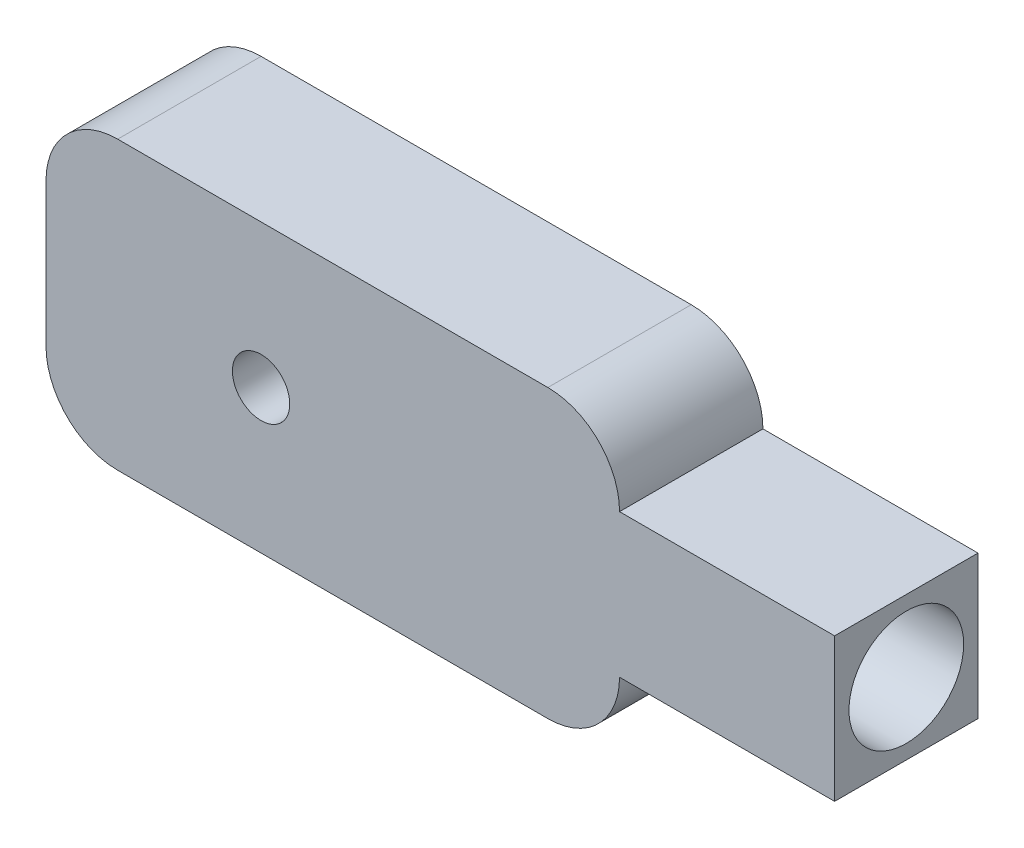
ISO-10303-21;
HEADER;
FILE_DESCRIPTION(('STEP AP214'),'2;1');
FILE_NAME('part.step','',(''),(''),'','','');
FILE_SCHEMA(('AUTOMOTIVE_DESIGN { 1 0 10303 214 1 1 1 1 }'));
ENDSEC;
DATA;
#1=APPLICATION_CONTEXT('core data for automotive mechanical design processes');
#2=APPLICATION_PROTOCOL_DEFINITION('international standard','automotive_design',2000,#1);
#3=PRODUCT_CONTEXT('',#1,'mechanical');
#4=PRODUCT('Part','Part','',(#3));
#5=PRODUCT_RELATED_PRODUCT_CATEGORY('part','',(#4));
#6=PRODUCT_DEFINITION_FORMATION('','',#4);
#7=PRODUCT_DEFINITION_CONTEXT('part definition',#1,'design');
#8=PRODUCT_DEFINITION('design','',#6,#7);
#9=PRODUCT_DEFINITION_SHAPE('','',#8);
#10=(LENGTH_UNIT() NAMED_UNIT(*) SI_UNIT(.MILLI.,.METRE.));
#11=(NAMED_UNIT(*) PLANE_ANGLE_UNIT() SI_UNIT($,.RADIAN.));
#12=(NAMED_UNIT(*) SI_UNIT($,.STERADIAN.) SOLID_ANGLE_UNIT());
#13=UNCERTAINTY_MEASURE_WITH_UNIT(LENGTH_MEASURE(1.E-05),#10,'distance_accuracy_value','');
#14=(GEOMETRIC_REPRESENTATION_CONTEXT(3) GLOBAL_UNCERTAINTY_ASSIGNED_CONTEXT((#13)) GLOBAL_UNIT_ASSIGNED_CONTEXT((#10,
#11,#12)) REPRESENTATION_CONTEXT('',''));
#15=CARTESIAN_POINT('',(0.,0.,0.));
#16=DIRECTION('',(0.,0.,1.));
#17=DIRECTION('',(1.,0.,0.));
#18=AXIS2_PLACEMENT_3D('',#15,#16,#17);
#19=CARTESIAN_POINT('',(-25.4,-12.7,12.7));
#20=DIRECTION('',(1.,0.,0.));
#21=DIRECTION('',(0.,0.,-1.));
#22=AXIS2_PLACEMENT_3D('',#19,#20,#21);
#23=PLANE('',#22);
#24=DIRECTION('',(0.,-1.,0.));
#25=VECTOR('',#24,1.);
#26=CARTESIAN_POINT('',(-25.4,-12.7,0.));
#27=LINE('',#26,#25);
#28=CARTESIAN_POINT('',(-25.4,6.34999999999999,0.));
#29=VERTEX_POINT('',#28);
#30=CARTESIAN_POINT('',(-25.4,-6.35,0.));
#31=VERTEX_POINT('',#30);
#32=EDGE_CURVE('E145',#29,#31,#27,.T.);
#33=ORIENTED_EDGE('',*,*,#32,.T.);
#34=DIRECTION('',(0.,0.,-1.));
#35=VECTOR('',#34,1.);
#36=CARTESIAN_POINT('',(-25.4,-6.35,12.7));
#37=LINE('',#36,#35);
#38=CARTESIAN_POINT('',(-25.4,-6.35,12.7));
#39=VERTEX_POINT('',#38);
#40=EDGE_CURVE('E177',#31,#39,#37,.F.);
#41=ORIENTED_EDGE('',*,*,#40,.T.);
#42=DIRECTION('',(0.,-1.,0.));
#43=VECTOR('',#42,1.);
#44=CARTESIAN_POINT('',(-25.4,-12.7,12.7));
#45=LINE('',#44,#43);
#46=CARTESIAN_POINT('',(-25.4,6.34999999999999,12.7));
#47=VERTEX_POINT('',#46);
#48=EDGE_CURVE('E147',#47,#39,#45,.T.);
#49=ORIENTED_EDGE('',*,*,#48,.F.);
#50=DIRECTION('',(0.,0.,-1.));
#51=VECTOR('',#50,1.);
#52=CARTESIAN_POINT('',(-25.4,6.34999999999999,12.7));
#53=LINE('',#52,#51);
#54=EDGE_CURVE('E174',#47,#29,#53,.T.);
#55=ORIENTED_EDGE('',*,*,#54,.T.);
#56=EDGE_LOOP('',(#33,#41,#49,#55));
#57=FACE_BOUND('',#56,.T.);
#58=ADVANCED_FACE('F33',(#57),#23,.F.);
#59=CARTESIAN_POINT('',(25.4,-12.7,12.7));
#60=DIRECTION('',(0.,1.,0.));
#61=DIRECTION('',(-1.,0.,0.));
#62=AXIS2_PLACEMENT_3D('',#59,#60,#61);
#63=PLANE('',#62);
#64=DIRECTION('',(1.,0.,0.));
#65=VECTOR('',#64,1.);
#66=CARTESIAN_POINT('',(25.4,-12.7,12.7));
#67=LINE('',#66,#65);
#68=CARTESIAN_POINT('',(-19.05,-12.7,12.7));
#69=VERTEX_POINT('',#68);
#70=CARTESIAN_POINT('',(19.05,-12.7,12.7));
#71=VERTEX_POINT('',#70);
#72=EDGE_CURVE('E150',#69,#71,#67,.T.);
#73=ORIENTED_EDGE('',*,*,#72,.F.);
#74=DIRECTION('',(0.,0.,-1.));
#75=VECTOR('',#74,1.);
#76=CARTESIAN_POINT('',(-19.05,-12.7,12.7));
#77=LINE('',#76,#75);
#78=CARTESIAN_POINT('',(-19.05,-12.7,0.));
#79=VERTEX_POINT('',#78);
#80=EDGE_CURVE('E164',#69,#79,#77,.T.);
#81=ORIENTED_EDGE('',*,*,#80,.T.);
#82=DIRECTION('',(1.,0.,0.));
#83=VECTOR('',#82,1.);
#84=CARTESIAN_POINT('',(25.4,-12.7,0.));
#85=LINE('',#84,#83);
#86=CARTESIAN_POINT('',(19.05,-12.7,0.));
#87=VERTEX_POINT('',#86);
#88=EDGE_CURVE('E159',#79,#87,#85,.T.);
#89=ORIENTED_EDGE('',*,*,#88,.T.);
#90=DIRECTION('',(0.,0.,-1.));
#91=VECTOR('',#90,1.);
#92=CARTESIAN_POINT('',(19.05,-12.7,12.7));
#93=LINE('',#92,#91);
#94=EDGE_CURVE('E156',#87,#71,#93,.F.);
#95=ORIENTED_EDGE('',*,*,#94,.T.);
#96=EDGE_LOOP('',(#73,#81,#89,#95));
#97=FACE_BOUND('',#96,.T.);
#98=ADVANCED_FACE('F209',(#97),#63,.F.);
#99=CARTESIAN_POINT('',(25.4,12.7,12.7));
#100=DIRECTION('',(0.,-1.,0.));
#101=DIRECTION('',(1.,0.,0.));
#102=AXIS2_PLACEMENT_3D('',#99,#100,#101);
#103=PLANE('',#102);
#104=DIRECTION('',(-1.,0.,0.));
#105=VECTOR('',#104,1.);
#106=CARTESIAN_POINT('',(25.4,12.7,0.));
#107=LINE('',#106,#105);
#108=CARTESIAN_POINT('',(19.05,12.7,0.));
#109=VERTEX_POINT('',#108);
#110=CARTESIAN_POINT('',(-19.05,12.7,0.));
#111=VERTEX_POINT('',#110);
#112=EDGE_CURVE('E151',#109,#111,#107,.T.);
#113=ORIENTED_EDGE('',*,*,#112,.T.);
#114=DIRECTION('',(0.,0.,-1.));
#115=VECTOR('',#114,1.);
#116=CARTESIAN_POINT('',(-19.05,12.7,12.7));
#117=LINE('',#116,#115);
#118=CARTESIAN_POINT('',(-19.05,12.7,12.7));
#119=VERTEX_POINT('',#118);
#120=EDGE_CURVE('E11',#111,#119,#117,.F.);
#121=ORIENTED_EDGE('',*,*,#120,.T.);
#122=DIRECTION('',(-1.,0.,0.));
#123=VECTOR('',#122,1.);
#124=CARTESIAN_POINT('',(25.4,12.7,12.7));
#125=LINE('',#124,#123);
#126=CARTESIAN_POINT('',(19.05,12.7,12.7));
#127=VERTEX_POINT('',#126);
#128=EDGE_CURVE('E154',#127,#119,#125,.T.);
#129=ORIENTED_EDGE('',*,*,#128,.F.);
#130=DIRECTION('',(0.,0.,-1.));
#131=VECTOR('',#130,1.);
#132=CARTESIAN_POINT('',(19.05,12.7,12.7));
#133=LINE('',#132,#131);
#134=EDGE_CURVE('E41',#127,#109,#133,.T.);
#135=ORIENTED_EDGE('',*,*,#134,.T.);
#136=EDGE_LOOP('',(#113,#121,#129,#135));
#137=FACE_BOUND('',#136,.T.);
#138=ADVANCED_FACE('F192',(#137),#103,.F.);
#139=CARTESIAN_POINT('',(0.,0.,12.7));
#140=DIRECTION('',(0.,0.,1.));
#141=DIRECTION('',(1.,0.,0.));
#142=AXIS2_PLACEMENT_3D('',#139,#140,#141);
#143=PLANE('',#142);
#144=CARTESIAN_POINT('',(-6.35000000000001,0.,12.7));
#145=DIRECTION('',(0.,0.,1.));
#146=DIRECTION('',(1.,0.,0.));
#147=AXIS2_PLACEMENT_3D('',#144,#145,#146);
#148=CIRCLE('',#147,2.54);
#149=CARTESIAN_POINT('',(-3.81000000000001,0.,12.7));
#150=VERTEX_POINT('',#149);
#151=EDGE_CURVE('E135',#150,#150,#148,.T.);
#152=ORIENTED_EDGE('',*,*,#151,.F.);
#153=EDGE_LOOP('',(#152));
#154=FACE_BOUND('',#153,.T.);
#155=ORIENTED_EDGE('',*,*,#48,.T.);
#156=CARTESIAN_POINT('',(-19.05,-6.35,12.7));
#157=DIRECTION('',(0.,0.,1.));
#158=DIRECTION('',(1.,0.,0.));
#159=AXIS2_PLACEMENT_3D('',#156,#157,#158);
#160=CIRCLE('',#159,6.35);
#161=EDGE_CURVE('E184',#39,#69,#160,.T.);
#162=ORIENTED_EDGE('',*,*,#161,.T.);
#163=ORIENTED_EDGE('',*,*,#72,.T.);
#164=CARTESIAN_POINT('',(19.05,-6.35,12.7));
#165=DIRECTION('',(0.,0.,1.));
#166=DIRECTION('',(1.,0.,0.));
#167=AXIS2_PLACEMENT_3D('',#164,#165,#166);
#168=CIRCLE('',#167,6.35);
#169=CARTESIAN_POINT('',(25.4,-6.35,12.7));
#170=VERTEX_POINT('',#169);
#171=EDGE_CURVE('E182',#71,#170,#168,.T.);
#172=ORIENTED_EDGE('',*,*,#171,.T.);
#173=DIRECTION('',(-1.,0.,0.));
#174=VECTOR('',#173,1.);
#175=CARTESIAN_POINT('',(44.45,-6.35,12.7));
#176=LINE('',#175,#174);
#177=CARTESIAN_POINT('',(44.45,-6.35,12.7));
#178=VERTEX_POINT('',#177);
#179=EDGE_CURVE('E140',#178,#170,#176,.T.);
#180=ORIENTED_EDGE('',*,*,#179,.F.);
#181=DIRECTION('',(0.,-1.,0.));
#182=VECTOR('',#181,1.);
#183=CARTESIAN_POINT('',(44.45,6.35,12.7));
#184=LINE('',#183,#182);
#185=CARTESIAN_POINT('',(44.45,6.35,12.7));
#186=VERTEX_POINT('',#185);
#187=EDGE_CURVE('E118',#186,#178,#184,.T.);
#188=ORIENTED_EDGE('',*,*,#187,.F.);
#189=DIRECTION('',(-1.,0.,0.));
#190=VECTOR('',#189,1.);
#191=CARTESIAN_POINT('',(44.45,6.35,12.7));
#192=LINE('',#191,#190);
#193=CARTESIAN_POINT('',(25.4,6.35,12.7));
#194=VERTEX_POINT('',#193);
#195=EDGE_CURVE('E115',#186,#194,#192,.T.);
#196=ORIENTED_EDGE('',*,*,#195,.T.);
#197=CARTESIAN_POINT('',(19.05,6.35,12.7));
#198=DIRECTION('',(0.,0.,1.));
#199=DIRECTION('',(1.,0.,0.));
#200=AXIS2_PLACEMENT_3D('',#197,#198,#199);
#201=CIRCLE('',#200,6.35);
#202=EDGE_CURVE('E53',#194,#127,#201,.T.);
#203=ORIENTED_EDGE('',*,*,#202,.T.);
#204=ORIENTED_EDGE('',*,*,#128,.T.);
#205=CARTESIAN_POINT('',(-19.05,6.34999999999999,12.7));
#206=DIRECTION('',(0.,0.,1.));
#207=DIRECTION('',(1.,0.,0.));
#208=AXIS2_PLACEMENT_3D('',#205,#206,#207);
#209=CIRCLE('',#208,6.35);
#210=EDGE_CURVE('E180',#119,#47,#209,.T.);
#211=ORIENTED_EDGE('',*,*,#210,.T.);
#212=EDGE_LOOP('',(#155,#162,#163,#172,#180,#188,#196,#203,#204,#211));
#213=FACE_BOUND('',#212,.T.);
#214=ADVANCED_FACE('F203',(#154,#213),#143,.T.);
#215=CARTESIAN_POINT('',(0.,0.,0.));
#216=DIRECTION('',(0.,0.,1.));
#217=DIRECTION('',(1.,0.,0.));
#218=AXIS2_PLACEMENT_3D('',#215,#216,#217);
#219=PLANE('',#218);
#220=CARTESIAN_POINT('',(-6.35000000000001,0.,0.));
#221=DIRECTION('',(0.,0.,1.));
#222=DIRECTION('',(1.,0.,0.));
#223=AXIS2_PLACEMENT_3D('',#220,#221,#222);
#224=CIRCLE('',#223,2.54);
#225=CARTESIAN_POINT('',(-3.81000000000001,0.,0.));
#226=VERTEX_POINT('',#225);
#227=EDGE_CURVE('E138',#226,#226,#224,.T.);
#228=ORIENTED_EDGE('',*,*,#227,.T.);
#229=EDGE_LOOP('',(#228));
#230=FACE_BOUND('',#229,.T.);
#231=ORIENTED_EDGE('',*,*,#88,.F.);
#232=CARTESIAN_POINT('',(-19.05,-6.35,0.));
#233=DIRECTION('',(0.,0.,1.));
#234=DIRECTION('',(1.,0.,0.));
#235=AXIS2_PLACEMENT_3D('',#232,#233,#234);
#236=CIRCLE('',#235,6.35);
#237=EDGE_CURVE('E172',#79,#31,#236,.F.);
#238=ORIENTED_EDGE('',*,*,#237,.T.);
#239=ORIENTED_EDGE('',*,*,#32,.F.);
#240=CARTESIAN_POINT('',(-19.05,6.34999999999999,0.));
#241=DIRECTION('',(0.,0.,1.));
#242=DIRECTION('',(1.,0.,0.));
#243=AXIS2_PLACEMENT_3D('',#240,#241,#242);
#244=CIRCLE('',#243,6.35);
#245=EDGE_CURVE('E168',#29,#111,#244,.F.);
#246=ORIENTED_EDGE('',*,*,#245,.T.);
#247=ORIENTED_EDGE('',*,*,#112,.F.);
#248=CARTESIAN_POINT('',(19.05,6.35,0.));
#249=DIRECTION('',(0.,0.,1.));
#250=DIRECTION('',(1.,0.,0.));
#251=AXIS2_PLACEMENT_3D('',#248,#249,#250);
#252=CIRCLE('',#251,6.35);
#253=CARTESIAN_POINT('',(25.4,6.35,0.));
#254=VERTEX_POINT('',#253);
#255=EDGE_CURVE('E133',#109,#254,#252,.F.);
#256=ORIENTED_EDGE('',*,*,#255,.T.);
#257=DIRECTION('',(-1.,0.,0.));
#258=VECTOR('',#257,1.);
#259=CARTESIAN_POINT('',(44.45,6.35,0.));
#260=LINE('',#259,#258);
#261=CARTESIAN_POINT('',(44.45,6.35,0.));
#262=VERTEX_POINT('',#261);
#263=EDGE_CURVE('E114',#262,#254,#260,.T.);
#264=ORIENTED_EDGE('',*,*,#263,.F.);
#265=DIRECTION('',(0.,1.,0.));
#266=VECTOR('',#265,1.);
#267=CARTESIAN_POINT('',(44.45,6.35,0.));
#268=LINE('',#267,#266);
#269=CARTESIAN_POINT('',(44.45,-6.35,0.));
#270=VERTEX_POINT('',#269);
#271=EDGE_CURVE('E119',#270,#262,#268,.T.);
#272=ORIENTED_EDGE('',*,*,#271,.F.);
#273=DIRECTION('',(-1.,0.,0.));
#274=VECTOR('',#273,1.);
#275=CARTESIAN_POINT('',(44.45,-6.35,0.));
#276=LINE('',#275,#274);
#277=CARTESIAN_POINT('',(25.4,-6.35,0.));
#278=VERTEX_POINT('',#277);
#279=EDGE_CURVE('E211',#270,#278,#276,.T.);
#280=ORIENTED_EDGE('',*,*,#279,.T.);
#281=CARTESIAN_POINT('',(19.05,-6.35,0.));
#282=DIRECTION('',(0.,0.,1.));
#283=DIRECTION('',(1.,0.,0.));
#284=AXIS2_PLACEMENT_3D('',#281,#282,#283);
#285=CIRCLE('',#284,6.35);
#286=EDGE_CURVE('E170',#278,#87,#285,.F.);
#287=ORIENTED_EDGE('',*,*,#286,.T.);
#288=EDGE_LOOP('',(#231,#238,#239,#246,#247,#256,#264,#272,#280,#287));
#289=FACE_BOUND('',#288,.T.);
#290=ADVANCED_FACE('F131',(#230,#289),#219,.F.);
#291=CARTESIAN_POINT('',(-19.05,-6.35,12.7));
#292=DIRECTION('',(0.,0.,-1.));
#293=DIRECTION('',(-1.,0.,0.));
#294=AXIS2_PLACEMENT_3D('',#291,#292,#293);
#295=CYLINDRICAL_SURFACE('',#294,6.35);
#296=ORIENTED_EDGE('',*,*,#161,.F.);
#297=ORIENTED_EDGE('',*,*,#40,.F.);
#298=ORIENTED_EDGE('',*,*,#237,.F.);
#299=ORIENTED_EDGE('',*,*,#80,.F.);
#300=EDGE_LOOP('',(#296,#297,#298,#299));
#301=FACE_BOUND('',#300,.T.);
#302=ADVANCED_FACE('F207',(#301),#295,.T.);
#303=CARTESIAN_POINT('',(19.05,-6.35,12.7));
#304=DIRECTION('',(0.,0.,-1.));
#305=DIRECTION('',(-1.,0.,0.));
#306=AXIS2_PLACEMENT_3D('',#303,#304,#305);
#307=CYLINDRICAL_SURFACE('',#306,6.35);
#308=ORIENTED_EDGE('',*,*,#171,.F.);
#309=ORIENTED_EDGE('',*,*,#94,.F.);
#310=ORIENTED_EDGE('',*,*,#286,.F.);
#311=DIRECTION('',(0.,0.,-1.));
#312=VECTOR('',#311,1.);
#313=CARTESIAN_POINT('',(25.4,-6.35,12.7));
#314=LINE('',#313,#312);
#315=EDGE_CURVE('E188',#170,#278,#314,.T.);
#316=ORIENTED_EDGE('',*,*,#315,.F.);
#317=EDGE_LOOP('',(#308,#309,#310,#316));
#318=FACE_BOUND('',#317,.T.);
#319=ADVANCED_FACE('F215',(#318),#307,.T.);
#320=CARTESIAN_POINT('',(-19.05,6.34999999999999,12.7));
#321=DIRECTION('',(0.,0.,-1.));
#322=DIRECTION('',(-1.,0.,0.));
#323=AXIS2_PLACEMENT_3D('',#320,#321,#322);
#324=CYLINDRICAL_SURFACE('',#323,6.35);
#325=ORIENTED_EDGE('',*,*,#210,.F.);
#326=ORIENTED_EDGE('',*,*,#120,.F.);
#327=ORIENTED_EDGE('',*,*,#245,.F.);
#328=ORIENTED_EDGE('',*,*,#54,.F.);
#329=EDGE_LOOP('',(#325,#326,#327,#328));
#330=FACE_BOUND('',#329,.T.);
#331=ADVANCED_FACE('F198',(#330),#324,.T.);
#332=CARTESIAN_POINT('',(19.05,6.35,12.7));
#333=DIRECTION('',(0.,0.,-1.));
#334=DIRECTION('',(-1.,0.,0.));
#335=AXIS2_PLACEMENT_3D('',#332,#333,#334);
#336=CYLINDRICAL_SURFACE('',#335,6.35);
#337=ORIENTED_EDGE('',*,*,#202,.F.);
#338=DIRECTION('',(0.,0.,-1.));
#339=VECTOR('',#338,1.);
#340=CARTESIAN_POINT('',(25.4,6.35,12.7));
#341=LINE('',#340,#339);
#342=EDGE_CURVE('E186',#254,#194,#341,.F.);
#343=ORIENTED_EDGE('',*,*,#342,.F.);
#344=ORIENTED_EDGE('',*,*,#255,.F.);
#345=ORIENTED_EDGE('',*,*,#134,.F.);
#346=EDGE_LOOP('',(#337,#343,#344,#345));
#347=FACE_BOUND('',#346,.T.);
#348=ADVANCED_FACE('F35',(#347),#336,.T.);
#349=CARTESIAN_POINT('',(-6.35000000000001,0.,0.));
#350=DIRECTION('',(0.,0.,1.));
#351=DIRECTION('',(1.,0.,0.));
#352=AXIS2_PLACEMENT_3D('',#349,#350,#351);
#353=CYLINDRICAL_SURFACE('',#352,2.54);
#354=ORIENTED_EDGE('',*,*,#227,.F.);
#355=EDGE_LOOP('',(#354));
#356=FACE_BOUND('',#355,.T.);
#357=ORIENTED_EDGE('',*,*,#151,.T.);
#358=EDGE_LOOP('',(#357));
#359=FACE_BOUND('',#358,.T.);
#360=ADVANCED_FACE('F259',(#356,#359),#353,.F.);
#361=CARTESIAN_POINT('',(44.45,6.35,0.));
#362=DIRECTION('',(0.,-1.,0.));
#363=DIRECTION('',(0.,0.,-1.));
#364=AXIS2_PLACEMENT_3D('',#361,#362,#363);
#365=PLANE('',#364);
#366=ORIENTED_EDGE('',*,*,#342,.T.);
#367=ORIENTED_EDGE('',*,*,#195,.F.);
#368=DIRECTION('',(0.,0.,1.));
#369=VECTOR('',#368,1.);
#370=CARTESIAN_POINT('',(44.45,6.35,0.));
#371=LINE('',#370,#369);
#372=EDGE_CURVE('E109',#262,#186,#371,.T.);
#373=ORIENTED_EDGE('',*,*,#372,.F.);
#374=ORIENTED_EDGE('',*,*,#263,.T.);
#375=EDGE_LOOP('',(#366,#367,#373,#374));
#376=FACE_BOUND('',#375,.T.);
#377=ADVANCED_FACE('F112',(#376),#365,.F.);
#378=CARTESIAN_POINT('',(44.45,-6.35,0.));
#379=DIRECTION('',(0.,1.,0.));
#380=DIRECTION('',(0.,0.,1.));
#381=AXIS2_PLACEMENT_3D('',#378,#379,#380);
#382=PLANE('',#381);
#383=ORIENTED_EDGE('',*,*,#315,.T.);
#384=ORIENTED_EDGE('',*,*,#279,.F.);
#385=DIRECTION('',(0.,0.,-1.));
#386=VECTOR('',#385,1.);
#387=CARTESIAN_POINT('',(44.45,-6.35,0.));
#388=LINE('',#387,#386);
#389=EDGE_CURVE('E124',#178,#270,#388,.T.);
#390=ORIENTED_EDGE('',*,*,#389,.F.);
#391=ORIENTED_EDGE('',*,*,#179,.T.);
#392=EDGE_LOOP('',(#383,#384,#390,#391));
#393=FACE_BOUND('',#392,.T.);
#394=ADVANCED_FACE('F218',(#393),#382,.F.);
#395=CARTESIAN_POINT('',(44.45,0.,0.));
#396=DIRECTION('',(-1.,0.,0.));
#397=DIRECTION('',(0.,0.,1.));
#398=AXIS2_PLACEMENT_3D('',#395,#396,#397);
#399=PLANE('',#398);
#400=CARTESIAN_POINT('',(44.45,0.,6.35));
#401=DIRECTION('',(1.,0.,0.));
#402=DIRECTION('',(0.,0.,-1.));
#403=AXIS2_PLACEMENT_3D('',#400,#401,#402);
#404=CIRCLE('',#403,5.08);
#405=CARTESIAN_POINT('',(44.45,0.,1.27));
#406=VERTEX_POINT('',#405);
#407=EDGE_CURVE('E224',#406,#406,#404,.T.);
#408=ORIENTED_EDGE('',*,*,#407,.F.);
#409=EDGE_LOOP('',(#408));
#410=FACE_BOUND('',#409,.T.);
#411=ORIENTED_EDGE('',*,*,#271,.T.);
#412=ORIENTED_EDGE('',*,*,#372,.T.);
#413=ORIENTED_EDGE('',*,*,#187,.T.);
#414=ORIENTED_EDGE('',*,*,#389,.T.);
#415=EDGE_LOOP('',(#411,#412,#413,#414));
#416=FACE_BOUND('',#415,.T.);
#417=ADVANCED_FACE('F122',(#410,#416),#399,.F.);
#418=CARTESIAN_POINT('',(19.05,0.,6.35));
#419=DIRECTION('',(1.,0.,0.));
#420=DIRECTION('',(0.,0.,-1.));
#421=AXIS2_PLACEMENT_3D('',#418,#419,#420);
#422=CYLINDRICAL_SURFACE('',#421,5.08);
#423=CARTESIAN_POINT('',(19.05,0.,6.35));
#424=DIRECTION('',(1.,0.,0.));
#425=DIRECTION('',(0.,0.,-1.));
#426=AXIS2_PLACEMENT_3D('',#423,#424,#425);
#427=CIRCLE('',#426,5.08);
#428=CARTESIAN_POINT('',(19.05,0.,1.27));
#429=VERTEX_POINT('',#428);
#430=EDGE_CURVE('E128',#429,#429,#427,.T.);
#431=ORIENTED_EDGE('',*,*,#430,.F.);
#432=EDGE_LOOP('',(#431));
#433=FACE_BOUND('',#432,.T.);
#434=ORIENTED_EDGE('',*,*,#407,.T.);
#435=EDGE_LOOP('',(#434));
#436=FACE_BOUND('',#435,.T.);
#437=ADVANCED_FACE('F232',(#433,#436),#422,.F.);
#438=CARTESIAN_POINT('',(19.05,0.,6.35));
#439=DIRECTION('',(1.,0.,0.));
#440=DIRECTION('',(0.,0.,-1.));
#441=AXIS2_PLACEMENT_3D('',#438,#439,#440);
#442=PLANE('',#441);
#443=ORIENTED_EDGE('',*,*,#430,.T.);
#444=EDGE_LOOP('',(#443));
#445=FACE_BOUND('',#444,.T.);
#446=ADVANCED_FACE('F230',(#445),#442,.T.);
#447=CLOSED_SHELL('',(#58,#98,#138,#214,#290,#302,#319,#331,#348,#360,#377,#394,#417,#437,#446));
#448=MANIFOLD_SOLID_BREP('B2',#447);
#449=ADVANCED_BREP_SHAPE_REPRESENTATION('',(#18,#448),#14);
#450=SHAPE_DEFINITION_REPRESENTATION(#9,#449);
ENDSEC;
END-ISO-10303-21;
